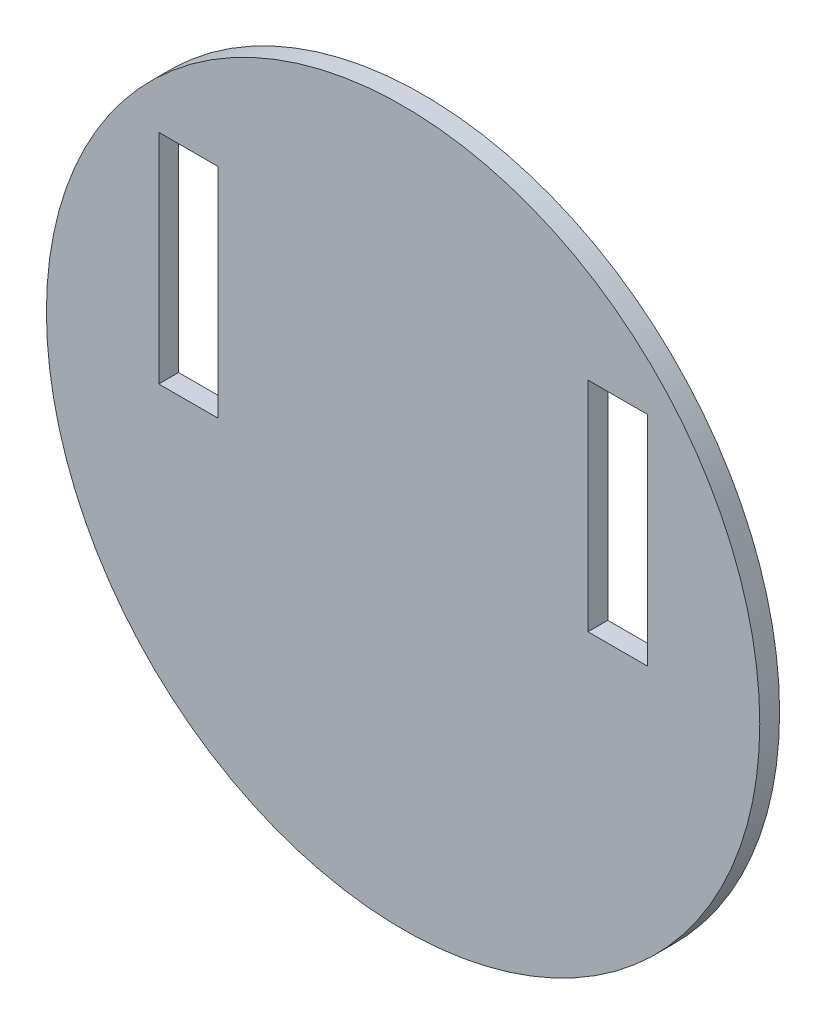
ISO-10303-21;
HEADER;
FILE_DESCRIPTION(('STEP AP214'),'2;1');
FILE_NAME('part.step','',(''),(''),'','','');
FILE_SCHEMA(('AUTOMOTIVE_DESIGN { 1 0 10303 214 1 1 1 1 }'));
ENDSEC;
DATA;
#1=APPLICATION_CONTEXT('core data for automotive mechanical design processes');
#2=APPLICATION_PROTOCOL_DEFINITION('international standard','automotive_design',2000,#1);
#3=PRODUCT_CONTEXT('',#1,'mechanical');
#4=PRODUCT('Part','Part','',(#3));
#5=PRODUCT_RELATED_PRODUCT_CATEGORY('part','',(#4));
#6=PRODUCT_DEFINITION_FORMATION('','',#4);
#7=PRODUCT_DEFINITION_CONTEXT('part definition',#1,'design');
#8=PRODUCT_DEFINITION('design','',#6,#7);
#9=PRODUCT_DEFINITION_SHAPE('','',#8);
#10=(LENGTH_UNIT() NAMED_UNIT(*) SI_UNIT(.MILLI.,.METRE.));
#11=(NAMED_UNIT(*) PLANE_ANGLE_UNIT() SI_UNIT($,.RADIAN.));
#12=(NAMED_UNIT(*) SI_UNIT($,.STERADIAN.) SOLID_ANGLE_UNIT());
#13=UNCERTAINTY_MEASURE_WITH_UNIT(LENGTH_MEASURE(1.E-05),#10,'distance_accuracy_value','');
#14=(GEOMETRIC_REPRESENTATION_CONTEXT(3) GLOBAL_UNCERTAINTY_ASSIGNED_CONTEXT((#13)) GLOBAL_UNIT_ASSIGNED_CONTEXT((#10,
#11,#12)) REPRESENTATION_CONTEXT('',''));
#15=CARTESIAN_POINT('',(0.,0.,0.));
#16=DIRECTION('',(0.,0.,1.));
#17=DIRECTION('',(1.,0.,0.));
#18=AXIS2_PLACEMENT_3D('',#15,#16,#17);
#19=CARTESIAN_POINT('',(0.,0.,5.));
#20=DIRECTION('',(0.,0.,1.));
#21=DIRECTION('',(1.,0.,0.));
#22=AXIS2_PLACEMENT_3D('',#19,#20,#21);
#23=PLANE('',#22);
#24=CARTESIAN_POINT('',(0.,0.,5.));
#25=DIRECTION('',(0.,0.,1.));
#26=DIRECTION('',(1.,0.,0.));
#27=AXIS2_PLACEMENT_3D('',#24,#25,#26);
#28=CIRCLE('',#27,90.);
#29=CARTESIAN_POINT('',(90.,0.,5.));
#30=VERTEX_POINT('',#29);
#31=EDGE_CURVE('E11',#30,#30,#28,.T.);
#32=ORIENTED_EDGE('',*,*,#31,.T.);
#33=EDGE_LOOP('',(#32));
#34=FACE_BOUND('',#33,.T.);
#35=DIRECTION('',(-1.,0.,0.));
#36=VECTOR('',#35,1.);
#37=CARTESIAN_POINT('',(46.6453199174476,53.4028570510425,5.));
#38=LINE('',#37,#36);
#39=CARTESIAN_POINT('',(61.6453199174476,53.4028570510425,5.));
#40=VERTEX_POINT('',#39);
#41=CARTESIAN_POINT('',(46.6453199174476,53.4028570510425,5.));
#42=VERTEX_POINT('',#41);
#43=EDGE_CURVE('E156',#40,#42,#38,.T.);
#44=ORIENTED_EDGE('',*,*,#43,.F.);
#45=DIRECTION('',(0.,1.,0.));
#46=VECTOR('',#45,1.);
#47=CARTESIAN_POINT('',(61.6453199174476,-1.59714294895752,5.));
#48=LINE('',#47,#46);
#49=CARTESIAN_POINT('',(61.6453199174476,-1.59714294895752,5.));
#50=VERTEX_POINT('',#49);
#51=EDGE_CURVE('E153',#50,#40,#48,.T.);
#52=ORIENTED_EDGE('',*,*,#51,.F.);
#53=DIRECTION('',(1.,0.,0.));
#54=VECTOR('',#53,1.);
#55=CARTESIAN_POINT('',(46.6453199174476,-1.59714294895752,5.));
#56=LINE('',#55,#54);
#57=CARTESIAN_POINT('',(46.6453199174476,-1.59714294895752,5.));
#58=VERTEX_POINT('',#57);
#59=EDGE_CURVE('E164',#58,#50,#56,.T.);
#60=ORIENTED_EDGE('',*,*,#59,.F.);
#61=DIRECTION('',(0.,-1.,0.));
#62=VECTOR('',#61,1.);
#63=CARTESIAN_POINT('',(46.6453199174476,-1.59714294895752,5.));
#64=LINE('',#63,#62);
#65=EDGE_CURVE('E160',#42,#58,#64,.T.);
#66=ORIENTED_EDGE('',*,*,#65,.F.);
#67=EDGE_LOOP('',(#44,#52,#60,#66));
#68=FACE_BOUND('',#67,.T.);
#69=DIRECTION('',(-1.,0.,0.));
#70=VECTOR('',#69,1.);
#71=CARTESIAN_POINT('',(-61.6453199174476,53.4028570510425,5.));
#72=LINE('',#71,#70);
#73=CARTESIAN_POINT('',(-46.6453199174476,53.4028570510425,5.));
#74=VERTEX_POINT('',#73);
#75=CARTESIAN_POINT('',(-61.6453199174476,53.4028570510425,5.));
#76=VERTEX_POINT('',#75);
#77=EDGE_CURVE('E114',#74,#76,#72,.T.);
#78=ORIENTED_EDGE('',*,*,#77,.F.);
#79=DIRECTION('',(0.,1.,0.));
#80=VECTOR('',#79,1.);
#81=CARTESIAN_POINT('',(-46.6453199174476,-1.59714294895752,5.));
#82=LINE('',#81,#80);
#83=CARTESIAN_POINT('',(-46.6453199174476,-1.59714294895752,5.));
#84=VERTEX_POINT('',#83);
#85=EDGE_CURVE('E105',#84,#74,#82,.T.);
#86=ORIENTED_EDGE('',*,*,#85,.F.);
#87=DIRECTION('',(1.,0.,0.));
#88=VECTOR('',#87,1.);
#89=CARTESIAN_POINT('',(-61.6453199174476,-1.59714294895752,5.));
#90=LINE('',#89,#88);
#91=CARTESIAN_POINT('',(-61.6453199174476,-1.59714294895752,5.));
#92=VERTEX_POINT('',#91);
#93=EDGE_CURVE('E131',#92,#84,#90,.T.);
#94=ORIENTED_EDGE('',*,*,#93,.F.);
#95=DIRECTION('',(0.,-1.,0.));
#96=VECTOR('',#95,1.);
#97=CARTESIAN_POINT('',(-61.6453199174476,-1.59714294895752,5.));
#98=LINE('',#97,#96);
#99=EDGE_CURVE('E127',#76,#92,#98,.T.);
#100=ORIENTED_EDGE('',*,*,#99,.F.);
#101=EDGE_LOOP('',(#78,#86,#94,#100));
#102=FACE_BOUND('',#101,.T.);
#103=ADVANCED_FACE('F39',(#34,#68,#102),#23,.T.);
#104=CARTESIAN_POINT('',(0.,0.,0.));
#105=DIRECTION('',(0.,0.,1.));
#106=DIRECTION('',(1.,0.,0.));
#107=AXIS2_PLACEMENT_3D('',#104,#105,#106);
#108=PLANE('',#107);
#109=DIRECTION('',(0.,1.,0.));
#110=VECTOR('',#109,1.);
#111=CARTESIAN_POINT('',(61.6453199174476,-1.59714294895752,0.));
#112=LINE('',#111,#110);
#113=CARTESIAN_POINT('',(61.6453199174476,-1.59714294895752,0.));
#114=VERTEX_POINT('',#113);
#115=CARTESIAN_POINT('',(61.6453199174476,53.4028570510425,0.));
#116=VERTEX_POINT('',#115);
#117=EDGE_CURVE('E123',#114,#116,#112,.T.);
#118=ORIENTED_EDGE('',*,*,#117,.T.);
#119=DIRECTION('',(-1.,0.,0.));
#120=VECTOR('',#119,1.);
#121=CARTESIAN_POINT('',(46.6453199174476,53.4028570510425,0.));
#122=LINE('',#121,#120);
#123=CARTESIAN_POINT('',(46.6453199174476,53.4028570510425,0.));
#124=VERTEX_POINT('',#123);
#125=EDGE_CURVE('E171',#116,#124,#122,.T.);
#126=ORIENTED_EDGE('',*,*,#125,.T.);
#127=DIRECTION('',(0.,-1.,0.));
#128=VECTOR('',#127,1.);
#129=CARTESIAN_POINT('',(46.6453199174476,-1.59714294895752,0.));
#130=LINE('',#129,#128);
#131=CARTESIAN_POINT('',(46.6453199174476,-1.59714294895752,0.));
#132=VERTEX_POINT('',#131);
#133=EDGE_CURVE('E175',#124,#132,#130,.T.);
#134=ORIENTED_EDGE('',*,*,#133,.T.);
#135=DIRECTION('',(1.,0.,0.));
#136=VECTOR('',#135,1.);
#137=CARTESIAN_POINT('',(46.6453199174476,-1.59714294895752,0.));
#138=LINE('',#137,#136);
#139=EDGE_CURVE('E157',#132,#114,#138,.T.);
#140=ORIENTED_EDGE('',*,*,#139,.T.);
#141=EDGE_LOOP('',(#118,#126,#134,#140));
#142=FACE_BOUND('',#141,.T.);
#143=CARTESIAN_POINT('',(0.,0.,0.));
#144=DIRECTION('',(0.,0.,1.));
#145=DIRECTION('',(1.,0.,0.));
#146=AXIS2_PLACEMENT_3D('',#143,#144,#145);
#147=CIRCLE('',#146,90.);
#148=CARTESIAN_POINT('',(90.,0.,0.));
#149=VERTEX_POINT('',#148);
#150=EDGE_CURVE('E43',#149,#149,#147,.T.);
#151=ORIENTED_EDGE('',*,*,#150,.F.);
#152=EDGE_LOOP('',(#151));
#153=FACE_BOUND('',#152,.T.);
#154=DIRECTION('',(0.,1.,0.));
#155=VECTOR('',#154,1.);
#156=CARTESIAN_POINT('',(-46.6453199174476,-1.59714294895752,0.));
#157=LINE('',#156,#155);
#158=CARTESIAN_POINT('',(-46.6453199174476,-1.59714294895752,0.));
#159=VERTEX_POINT('',#158);
#160=CARTESIAN_POINT('',(-46.6453199174476,53.4028570510425,0.));
#161=VERTEX_POINT('',#160);
#162=EDGE_CURVE('E63',#159,#161,#157,.T.);
#163=ORIENTED_EDGE('',*,*,#162,.T.);
#164=DIRECTION('',(-1.,0.,0.));
#165=VECTOR('',#164,1.);
#166=CARTESIAN_POINT('',(-61.6453199174476,53.4028570510425,0.));
#167=LINE('',#166,#165);
#168=CARTESIAN_POINT('',(-61.6453199174476,53.4028570510425,0.));
#169=VERTEX_POINT('',#168);
#170=EDGE_CURVE('E121',#161,#169,#167,.T.);
#171=ORIENTED_EDGE('',*,*,#170,.T.);
#172=DIRECTION('',(0.,-1.,0.));
#173=VECTOR('',#172,1.);
#174=CARTESIAN_POINT('',(-61.6453199174476,-1.59714294895752,0.));
#175=LINE('',#174,#173);
#176=CARTESIAN_POINT('',(-61.6453199174476,-1.59714294895752,0.));
#177=VERTEX_POINT('',#176);
#178=EDGE_CURVE('E140',#169,#177,#175,.T.);
#179=ORIENTED_EDGE('',*,*,#178,.T.);
#180=DIRECTION('',(1.,0.,0.));
#181=VECTOR('',#180,1.);
#182=CARTESIAN_POINT('',(-61.6453199174476,-1.59714294895752,0.));
#183=LINE('',#182,#181);
#184=EDGE_CURVE('E115',#177,#159,#183,.T.);
#185=ORIENTED_EDGE('',*,*,#184,.T.);
#186=EDGE_LOOP('',(#163,#171,#179,#185));
#187=FACE_BOUND('',#186,.T.);
#188=ADVANCED_FACE('F201',(#142,#153,#187),#108,.F.);
#189=CARTESIAN_POINT('',(0.,0.,5.));
#190=DIRECTION('',(0.,0.,-1.));
#191=DIRECTION('',(-1.,0.,0.));
#192=AXIS2_PLACEMENT_3D('',#189,#190,#191);
#193=CYLINDRICAL_SURFACE('',#192,90.);
#194=ORIENTED_EDGE('',*,*,#31,.F.);
#195=EDGE_LOOP('',(#194));
#196=FACE_BOUND('',#195,.T.);
#197=ORIENTED_EDGE('',*,*,#150,.T.);
#198=EDGE_LOOP('',(#197));
#199=FACE_BOUND('',#198,.T.);
#200=ADVANCED_FACE('F41',(#196,#199),#193,.T.);
#201=CARTESIAN_POINT('',(61.6453199174476,-1.59714294895752,5.));
#202=DIRECTION('',(-1.,0.,0.));
#203=DIRECTION('',(0.,0.,1.));
#204=AXIS2_PLACEMENT_3D('',#201,#202,#203);
#205=PLANE('',#204);
#206=ORIENTED_EDGE('',*,*,#117,.F.);
#207=DIRECTION('',(0.,0.,-1.));
#208=VECTOR('',#207,1.);
#209=CARTESIAN_POINT('',(61.6453199174476,-1.59714294895752,5.));
#210=LINE('',#209,#208);
#211=EDGE_CURVE('E167',#50,#114,#210,.T.);
#212=ORIENTED_EDGE('',*,*,#211,.F.);
#213=ORIENTED_EDGE('',*,*,#51,.T.);
#214=DIRECTION('',(0.,0.,-1.));
#215=VECTOR('',#214,1.);
#216=CARTESIAN_POINT('',(61.6453199174476,53.4028570510425,5.));
#217=LINE('',#216,#215);
#218=EDGE_CURVE('E191',#40,#116,#217,.T.);
#219=ORIENTED_EDGE('',*,*,#218,.T.);
#220=EDGE_LOOP('',(#206,#212,#213,#219));
#221=FACE_BOUND('',#220,.T.);
#222=ADVANCED_FACE('F222',(#221),#205,.T.);
#223=CARTESIAN_POINT('',(46.6453199174476,53.4028570510425,5.));
#224=DIRECTION('',(0.,-1.,0.));
#225=DIRECTION('',(0.,0.,-1.));
#226=AXIS2_PLACEMENT_3D('',#223,#224,#225);
#227=PLANE('',#226);
#228=ORIENTED_EDGE('',*,*,#125,.F.);
#229=ORIENTED_EDGE('',*,*,#218,.F.);
#230=ORIENTED_EDGE('',*,*,#43,.T.);
#231=DIRECTION('',(0.,0.,-1.));
#232=VECTOR('',#231,1.);
#233=CARTESIAN_POINT('',(46.6453199174476,53.4028570510425,5.));
#234=LINE('',#233,#232);
#235=EDGE_CURVE('E188',#42,#124,#234,.T.);
#236=ORIENTED_EDGE('',*,*,#235,.T.);
#237=EDGE_LOOP('',(#228,#229,#230,#236));
#238=FACE_BOUND('',#237,.T.);
#239=ADVANCED_FACE('F225',(#238),#227,.T.);
#240=CARTESIAN_POINT('',(46.6453199174476,-1.59714294895752,5.));
#241=DIRECTION('',(1.,0.,0.));
#242=DIRECTION('',(0.,0.,-1.));
#243=AXIS2_PLACEMENT_3D('',#240,#241,#242);
#244=PLANE('',#243);
#245=ORIENTED_EDGE('',*,*,#133,.F.);
#246=ORIENTED_EDGE('',*,*,#235,.F.);
#247=ORIENTED_EDGE('',*,*,#65,.T.);
#248=DIRECTION('',(0.,0.,-1.));
#249=VECTOR('',#248,1.);
#250=CARTESIAN_POINT('',(46.6453199174476,-1.59714294895752,5.));
#251=LINE('',#250,#249);
#252=EDGE_CURVE('E185',#58,#132,#251,.T.);
#253=ORIENTED_EDGE('',*,*,#252,.T.);
#254=EDGE_LOOP('',(#245,#246,#247,#253));
#255=FACE_BOUND('',#254,.T.);
#256=ADVANCED_FACE('F228',(#255),#244,.T.);
#257=CARTESIAN_POINT('',(46.6453199174476,-1.59714294895752,5.));
#258=DIRECTION('',(0.,1.,0.));
#259=DIRECTION('',(0.,0.,1.));
#260=AXIS2_PLACEMENT_3D('',#257,#258,#259);
#261=PLANE('',#260);
#262=ORIENTED_EDGE('',*,*,#139,.F.);
#263=ORIENTED_EDGE('',*,*,#252,.F.);
#264=ORIENTED_EDGE('',*,*,#59,.T.);
#265=ORIENTED_EDGE('',*,*,#211,.T.);
#266=EDGE_LOOP('',(#262,#263,#264,#265));
#267=FACE_BOUND('',#266,.T.);
#268=ADVANCED_FACE('F232',(#267),#261,.T.);
#269=CARTESIAN_POINT('',(-46.6453199174476,-1.59714294895752,5.));
#270=DIRECTION('',(-1.,0.,0.));
#271=DIRECTION('',(0.,0.,1.));
#272=AXIS2_PLACEMENT_3D('',#269,#270,#271);
#273=PLANE('',#272);
#274=ORIENTED_EDGE('',*,*,#162,.F.);
#275=DIRECTION('',(0.,0.,-1.));
#276=VECTOR('',#275,1.);
#277=CARTESIAN_POINT('',(-46.6453199174476,-1.59714294895752,5.));
#278=LINE('',#277,#276);
#279=EDGE_CURVE('E109',#84,#159,#278,.T.);
#280=ORIENTED_EDGE('',*,*,#279,.F.);
#281=ORIENTED_EDGE('',*,*,#85,.T.);
#282=DIRECTION('',(0.,0.,-1.));
#283=VECTOR('',#282,1.);
#284=CARTESIAN_POINT('',(-46.6453199174476,53.4028570510425,5.));
#285=LINE('',#284,#283);
#286=EDGE_CURVE('E108',#74,#161,#285,.T.);
#287=ORIENTED_EDGE('',*,*,#286,.T.);
#288=EDGE_LOOP('',(#274,#280,#281,#287));
#289=FACE_BOUND('',#288,.T.);
#290=ADVANCED_FACE('F107',(#289),#273,.T.);
#291=CARTESIAN_POINT('',(-61.6453199174476,53.4028570510425,5.));
#292=DIRECTION('',(0.,-1.,0.));
#293=DIRECTION('',(0.,0.,-1.));
#294=AXIS2_PLACEMENT_3D('',#291,#292,#293);
#295=PLANE('',#294);
#296=ORIENTED_EDGE('',*,*,#170,.F.);
#297=ORIENTED_EDGE('',*,*,#286,.F.);
#298=ORIENTED_EDGE('',*,*,#77,.T.);
#299=DIRECTION('',(0.,0.,-1.));
#300=VECTOR('',#299,1.);
#301=CARTESIAN_POINT('',(-61.6453199174476,53.4028570510425,5.));
#302=LINE('',#301,#300);
#303=EDGE_CURVE('E124',#76,#169,#302,.T.);
#304=ORIENTED_EDGE('',*,*,#303,.T.);
#305=EDGE_LOOP('',(#296,#297,#298,#304));
#306=FACE_BOUND('',#305,.T.);
#307=ADVANCED_FACE('F118',(#306),#295,.T.);
#308=CARTESIAN_POINT('',(-61.6453199174476,-1.59714294895752,5.));
#309=DIRECTION('',(1.,0.,0.));
#310=DIRECTION('',(0.,0.,-1.));
#311=AXIS2_PLACEMENT_3D('',#308,#309,#310);
#312=PLANE('',#311);
#313=ORIENTED_EDGE('',*,*,#178,.F.);
#314=ORIENTED_EDGE('',*,*,#303,.F.);
#315=ORIENTED_EDGE('',*,*,#99,.T.);
#316=DIRECTION('',(0.,0.,-1.));
#317=VECTOR('',#316,1.);
#318=CARTESIAN_POINT('',(-61.6453199174476,-1.59714294895752,5.));
#319=LINE('',#318,#317);
#320=EDGE_CURVE('E55',#92,#177,#319,.T.);
#321=ORIENTED_EDGE('',*,*,#320,.T.);
#322=EDGE_LOOP('',(#313,#314,#315,#321));
#323=FACE_BOUND('',#322,.T.);
#324=ADVANCED_FACE('F208',(#323),#312,.T.);
#325=CARTESIAN_POINT('',(-61.6453199174476,-1.59714294895752,5.));
#326=DIRECTION('',(0.,1.,0.));
#327=DIRECTION('',(0.,0.,1.));
#328=AXIS2_PLACEMENT_3D('',#325,#326,#327);
#329=PLANE('',#328);
#330=ORIENTED_EDGE('',*,*,#184,.F.);
#331=ORIENTED_EDGE('',*,*,#320,.F.);
#332=ORIENTED_EDGE('',*,*,#93,.T.);
#333=ORIENTED_EDGE('',*,*,#279,.T.);
#334=EDGE_LOOP('',(#330,#331,#332,#333));
#335=FACE_BOUND('',#334,.T.);
#336=ADVANCED_FACE('F206',(#335),#329,.T.);
#337=CLOSED_SHELL('',(#103,#188,#200,#222,#239,#256,#268,#290,#307,#324,#336));
#338=MANIFOLD_SOLID_BREP('B2',#337);
#339=ADVANCED_BREP_SHAPE_REPRESENTATION('',(#18,#338),#14);
#340=SHAPE_DEFINITION_REPRESENTATION(#9,#339);
ENDSEC;
END-ISO-10303-21;
